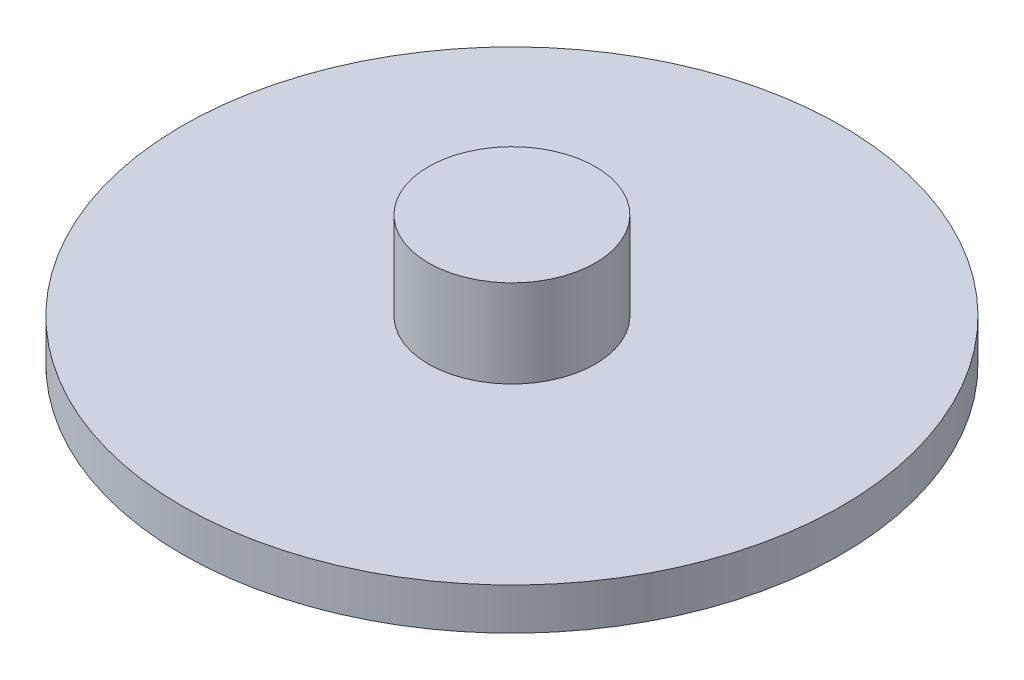
ISO-10303-21;
HEADER;
FILE_DESCRIPTION(('STEP AP214'),'2;1');
FILE_NAME('part.step','',(''),(''),'','','');
FILE_SCHEMA(('AUTOMOTIVE_DESIGN { 1 0 10303 214 1 1 1 1 }'));
ENDSEC;
DATA;
#1=APPLICATION_CONTEXT('core data for automotive mechanical design processes');
#2=APPLICATION_PROTOCOL_DEFINITION('international standard','automotive_design',2000,#1);
#3=PRODUCT_CONTEXT('',#1,'mechanical');
#4=PRODUCT('Part','Part','',(#3));
#5=PRODUCT_RELATED_PRODUCT_CATEGORY('part','',(#4));
#6=PRODUCT_DEFINITION_FORMATION('','',#4);
#7=PRODUCT_DEFINITION_CONTEXT('part definition',#1,'design');
#8=PRODUCT_DEFINITION('design','',#6,#7);
#9=PRODUCT_DEFINITION_SHAPE('','',#8);
#10=(LENGTH_UNIT() NAMED_UNIT(*) SI_UNIT(.MILLI.,.METRE.));
#11=(NAMED_UNIT(*) PLANE_ANGLE_UNIT() SI_UNIT($,.RADIAN.));
#12=(NAMED_UNIT(*) SI_UNIT($,.STERADIAN.) SOLID_ANGLE_UNIT());
#13=UNCERTAINTY_MEASURE_WITH_UNIT(LENGTH_MEASURE(1.E-05),#10,'distance_accuracy_value','');
#14=(GEOMETRIC_REPRESENTATION_CONTEXT(3) GLOBAL_UNCERTAINTY_ASSIGNED_CONTEXT((#13)) GLOBAL_UNIT_ASSIGNED_CONTEXT((#10,
#11,#12)) REPRESENTATION_CONTEXT('',''));
#15=CARTESIAN_POINT('',(0.,0.,0.));
#16=DIRECTION('',(0.,0.,1.));
#17=DIRECTION('',(1.,0.,0.));
#18=AXIS2_PLACEMENT_3D('',#15,#16,#17);
#19=CARTESIAN_POINT('',(0.,1.,0.));
#20=DIRECTION('',(0.,-1.,0.));
#21=DIRECTION('',(0.,0.,-1.));
#22=AXIS2_PLACEMENT_3D('',#19,#20,#21);
#23=CYLINDRICAL_SURFACE('',#22,7.9);
#24=CARTESIAN_POINT('',(0.,1.,0.));
#25=DIRECTION('',(0.,1.,0.));
#26=DIRECTION('',(0.,0.,1.));
#27=AXIS2_PLACEMENT_3D('',#24,#25,#26);
#28=CIRCLE('',#27,7.9);
#29=CARTESIAN_POINT('',(0.,1.,7.9));
#30=VERTEX_POINT('',#29);
#31=EDGE_CURVE('E42',#30,#30,#28,.T.);
#32=ORIENTED_EDGE('',*,*,#31,.F.);
#33=EDGE_LOOP('',(#32));
#34=FACE_BOUND('',#33,.T.);
#35=CARTESIAN_POINT('',(0.,0.,0.));
#36=DIRECTION('',(0.,1.,0.));
#37=DIRECTION('',(0.,0.,1.));
#38=AXIS2_PLACEMENT_3D('',#35,#36,#37);
#39=CIRCLE('',#38,7.9);
#40=CARTESIAN_POINT('',(0.,0.,7.9));
#41=VERTEX_POINT('',#40);
#42=EDGE_CURVE('E38',#41,#41,#39,.T.);
#43=ORIENTED_EDGE('',*,*,#42,.T.);
#44=EDGE_LOOP('',(#43));
#45=FACE_BOUND('',#44,.T.);
#46=ADVANCED_FACE('F35',(#34,#45),#23,.T.);
#47=CARTESIAN_POINT('',(0.,1.,0.));
#48=DIRECTION('',(0.,1.,0.));
#49=DIRECTION('',(0.,0.,1.));
#50=AXIS2_PLACEMENT_3D('',#47,#48,#49);
#51=PLANE('',#50);
#52=CARTESIAN_POINT('',(0.,1.,0.));
#53=DIRECTION('',(0.,1.,0.));
#54=DIRECTION('',(0.,0.,1.));
#55=AXIS2_PLACEMENT_3D('',#52,#53,#54);
#56=CIRCLE('',#55,2.);
#57=CARTESIAN_POINT('',(0.,1.,2.));
#58=VERTEX_POINT('',#57);
#59=EDGE_CURVE('E10',#58,#58,#56,.T.);
#60=ORIENTED_EDGE('',*,*,#59,.F.);
#61=EDGE_LOOP('',(#60));
#62=FACE_BOUND('',#61,.T.);
#63=ORIENTED_EDGE('',*,*,#31,.T.);
#64=EDGE_LOOP('',(#63));
#65=FACE_BOUND('',#64,.T.);
#66=ADVANCED_FACE('F59',(#62,#65),#51,.T.);
#67=CARTESIAN_POINT('',(0.,0.,0.));
#68=DIRECTION('',(0.,1.,0.));
#69=DIRECTION('',(0.,0.,1.));
#70=AXIS2_PLACEMENT_3D('',#67,#68,#69);
#71=PLANE('',#70);
#72=ORIENTED_EDGE('',*,*,#42,.F.);
#73=EDGE_LOOP('',(#72));
#74=FACE_BOUND('',#73,.T.);
#75=ADVANCED_FACE('F56',(#74),#71,.F.);
#76=CARTESIAN_POINT('',(0.,3.1,0.));
#77=DIRECTION('',(0.,-1.,0.));
#78=DIRECTION('',(0.,0.,-1.));
#79=AXIS2_PLACEMENT_3D('',#76,#77,#78);
#80=CYLINDRICAL_SURFACE('',#79,2.);
#81=CARTESIAN_POINT('',(0.,3.1,0.));
#82=DIRECTION('',(0.,1.,0.));
#83=DIRECTION('',(0.,0.,1.));
#84=AXIS2_PLACEMENT_3D('',#81,#82,#83);
#85=CIRCLE('',#84,2.);
#86=CARTESIAN_POINT('',(0.,3.1,2.));
#87=VERTEX_POINT('',#86);
#88=EDGE_CURVE('E48',#87,#87,#85,.T.);
#89=ORIENTED_EDGE('',*,*,#88,.F.);
#90=EDGE_LOOP('',(#89));
#91=FACE_BOUND('',#90,.T.);
#92=ORIENTED_EDGE('',*,*,#59,.T.);
#93=EDGE_LOOP('',(#92));
#94=FACE_BOUND('',#93,.T.);
#95=ADVANCED_FACE('F58',(#91,#94),#80,.T.);
#96=CARTESIAN_POINT('',(0.,3.1,0.));
#97=DIRECTION('',(0.,1.,0.));
#98=DIRECTION('',(0.,0.,1.));
#99=AXIS2_PLACEMENT_3D('',#96,#97,#98);
#100=PLANE('',#99);
#101=ORIENTED_EDGE('',*,*,#88,.T.);
#102=EDGE_LOOP('',(#101));
#103=FACE_BOUND('',#102,.T.);
#104=ADVANCED_FACE('F64',(#103),#100,.T.);
#105=CLOSED_SHELL('',(#46,#66,#75,#95,#104));
#106=MANIFOLD_SOLID_BREP('B2',#105);
#107=ADVANCED_BREP_SHAPE_REPRESENTATION('',(#18,#106),#14);
#108=SHAPE_DEFINITION_REPRESENTATION(#9,#107);
ENDSEC;
END-ISO-10303-21;
